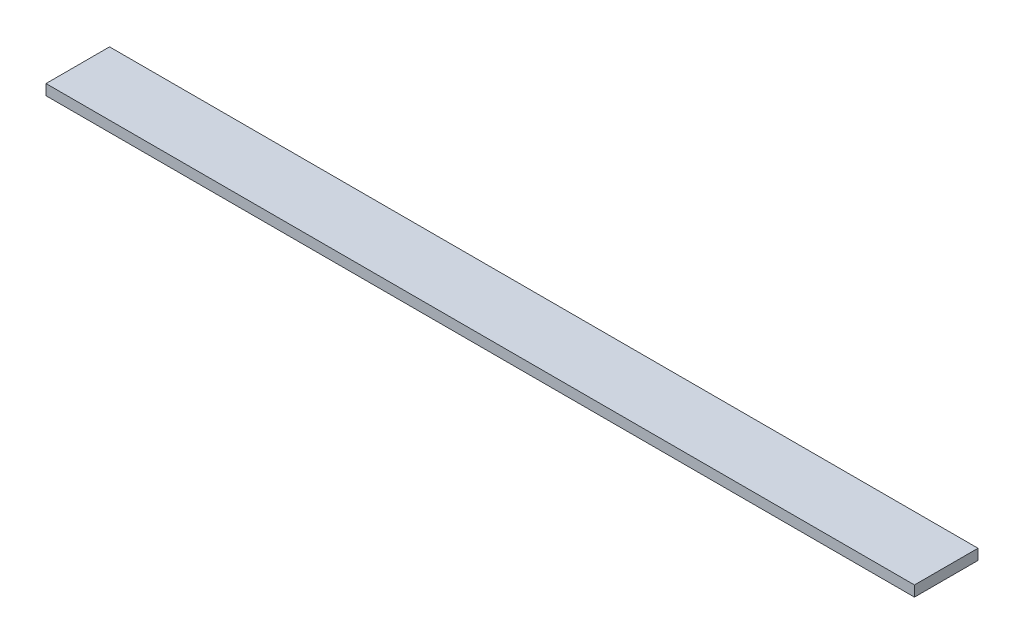
ISO-10303-21;
HEADER;
FILE_DESCRIPTION(('STEP AP214'),'2;1');
FILE_NAME('part.step','',(''),(''),'','','');
FILE_SCHEMA(('AUTOMOTIVE_DESIGN { 1 0 10303 214 1 1 1 1 }'));
ENDSEC;
DATA;
#1=APPLICATION_CONTEXT('core data for automotive mechanical design processes');
#2=APPLICATION_PROTOCOL_DEFINITION('international standard','automotive_design',2000,#1);
#3=PRODUCT_CONTEXT('',#1,'mechanical');
#4=PRODUCT('Part','Part','',(#3));
#5=PRODUCT_RELATED_PRODUCT_CATEGORY('part','',(#4));
#6=PRODUCT_DEFINITION_FORMATION('','',#4);
#7=PRODUCT_DEFINITION_CONTEXT('part definition',#1,'design');
#8=PRODUCT_DEFINITION('design','',#6,#7);
#9=PRODUCT_DEFINITION_SHAPE('','',#8);
#10=(LENGTH_UNIT() NAMED_UNIT(*) SI_UNIT(.MILLI.,.METRE.));
#11=(NAMED_UNIT(*) PLANE_ANGLE_UNIT() SI_UNIT($,.RADIAN.));
#12=(NAMED_UNIT(*) SI_UNIT($,.STERADIAN.) SOLID_ANGLE_UNIT());
#13=UNCERTAINTY_MEASURE_WITH_UNIT(LENGTH_MEASURE(1.E-05),#10,'distance_accuracy_value','');
#14=(GEOMETRIC_REPRESENTATION_CONTEXT(3) GLOBAL_UNCERTAINTY_ASSIGNED_CONTEXT((#13)) GLOBAL_UNIT_ASSIGNED_CONTEXT((#10,
#11,#12)) REPRESENTATION_CONTEXT('',''));
#15=CARTESIAN_POINT('',(0.,0.,0.));
#16=DIRECTION('',(0.,0.,1.));
#17=DIRECTION('',(1.,0.,0.));
#18=AXIS2_PLACEMENT_3D('',#15,#16,#17);
#19=CARTESIAN_POINT('',(0.,3.175,0.));
#20=DIRECTION('',(1.,0.,0.));
#21=DIRECTION('',(0.,0.,-1.));
#22=AXIS2_PLACEMENT_3D('',#19,#20,#21);
#23=PLANE('',#22);
#24=DIRECTION('',(0.,0.,1.));
#25=VECTOR('',#24,1.);
#26=CARTESIAN_POINT('',(0.,0.,0.));
#27=LINE('',#26,#25);
#28=CARTESIAN_POINT('',(0.,0.,-19.05));
#29=VERTEX_POINT('',#28);
#30=CARTESIAN_POINT('',(0.,0.,0.));
#31=VERTEX_POINT('',#30);
#32=EDGE_CURVE('E105',#29,#31,#27,.T.);
#33=ORIENTED_EDGE('',*,*,#32,.T.);
#34=DIRECTION('',(0.,-1.,0.));
#35=VECTOR('',#34,1.);
#36=CARTESIAN_POINT('',(0.,3.175,0.));
#37=LINE('',#36,#35);
#38=CARTESIAN_POINT('',(0.,3.175,0.));
#39=VERTEX_POINT('',#38);
#40=EDGE_CURVE('E11',#39,#31,#37,.T.);
#41=ORIENTED_EDGE('',*,*,#40,.F.);
#42=DIRECTION('',(0.,0.,1.));
#43=VECTOR('',#42,1.);
#44=CARTESIAN_POINT('',(0.,3.175,0.));
#45=LINE('',#44,#43);
#46=CARTESIAN_POINT('',(0.,3.175,-19.05));
#47=VERTEX_POINT('',#46);
#48=EDGE_CURVE('E89',#47,#39,#45,.T.);
#49=ORIENTED_EDGE('',*,*,#48,.F.);
#50=DIRECTION('',(0.,-1.,0.));
#51=VECTOR('',#50,1.);
#52=CARTESIAN_POINT('',(0.,3.175,-19.05));
#53=LINE('',#52,#51);
#54=EDGE_CURVE('E97',#47,#29,#53,.T.);
#55=ORIENTED_EDGE('',*,*,#54,.T.);
#56=EDGE_LOOP('',(#33,#41,#49,#55));
#57=FACE_BOUND('',#56,.T.);
#58=ADVANCED_FACE('F39',(#57),#23,.F.);
#59=CARTESIAN_POINT('',(0.,3.175,0.));
#60=DIRECTION('',(0.,0.,-1.));
#61=DIRECTION('',(-1.,0.,0.));
#62=AXIS2_PLACEMENT_3D('',#59,#60,#61);
#63=PLANE('',#62);
#64=DIRECTION('',(1.,0.,0.));
#65=VECTOR('',#64,1.);
#66=CARTESIAN_POINT('',(0.,0.,0.));
#67=LINE('',#66,#65);
#68=CARTESIAN_POINT('',(260.35,0.,0.));
#69=VERTEX_POINT('',#68);
#70=EDGE_CURVE('E92',#31,#69,#67,.T.);
#71=ORIENTED_EDGE('',*,*,#70,.T.);
#72=DIRECTION('',(0.,-1.,0.));
#73=VECTOR('',#72,1.);
#74=CARTESIAN_POINT('',(260.35,3.175,0.));
#75=LINE('',#74,#73);
#76=CARTESIAN_POINT('',(260.35,3.175,0.));
#77=VERTEX_POINT('',#76);
#78=EDGE_CURVE('E50',#77,#69,#75,.T.);
#79=ORIENTED_EDGE('',*,*,#78,.F.);
#80=DIRECTION('',(1.,0.,0.));
#81=VECTOR('',#80,1.);
#82=CARTESIAN_POINT('',(0.,3.175,0.));
#83=LINE('',#82,#81);
#84=EDGE_CURVE('E82',#39,#77,#83,.T.);
#85=ORIENTED_EDGE('',*,*,#84,.F.);
#86=ORIENTED_EDGE('',*,*,#40,.T.);
#87=EDGE_LOOP('',(#71,#79,#85,#86));
#88=FACE_BOUND('',#87,.T.);
#89=ADVANCED_FACE('F93',(#88),#63,.F.);
#90=CARTESIAN_POINT('',(260.35,3.175,0.));
#91=DIRECTION('',(-1.,0.,0.));
#92=DIRECTION('',(0.,0.,1.));
#93=AXIS2_PLACEMENT_3D('',#90,#91,#92);
#94=PLANE('',#93);
#95=DIRECTION('',(0.,0.,-1.));
#96=VECTOR('',#95,1.);
#97=CARTESIAN_POINT('',(260.35,0.,0.));
#98=LINE('',#97,#96);
#99=CARTESIAN_POINT('',(260.35,0.,-19.05));
#100=VERTEX_POINT('',#99);
#101=EDGE_CURVE('E75',#69,#100,#98,.T.);
#102=ORIENTED_EDGE('',*,*,#101,.T.);
#103=DIRECTION('',(0.,-1.,0.));
#104=VECTOR('',#103,1.);
#105=CARTESIAN_POINT('',(260.35,3.175,-19.05));
#106=LINE('',#105,#104);
#107=CARTESIAN_POINT('',(260.35,3.175,-19.05));
#108=VERTEX_POINT('',#107);
#109=EDGE_CURVE('E94',#108,#100,#106,.T.);
#110=ORIENTED_EDGE('',*,*,#109,.F.);
#111=DIRECTION('',(0.,0.,-1.));
#112=VECTOR('',#111,1.);
#113=CARTESIAN_POINT('',(260.35,3.175,0.));
#114=LINE('',#113,#112);
#115=EDGE_CURVE('E88',#77,#108,#114,.T.);
#116=ORIENTED_EDGE('',*,*,#115,.F.);
#117=ORIENTED_EDGE('',*,*,#78,.T.);
#118=EDGE_LOOP('',(#102,#110,#116,#117));
#119=FACE_BOUND('',#118,.T.);
#120=ADVANCED_FACE('F96',(#119),#94,.F.);
#121=CARTESIAN_POINT('',(0.,3.175,-19.05));
#122=DIRECTION('',(0.,0.,1.));
#123=DIRECTION('',(1.,0.,0.));
#124=AXIS2_PLACEMENT_3D('',#121,#122,#123);
#125=PLANE('',#124);
#126=DIRECTION('',(-1.,0.,0.));
#127=VECTOR('',#126,1.);
#128=CARTESIAN_POINT('',(0.,0.,-19.05));
#129=LINE('',#128,#127);
#130=EDGE_CURVE('E76',#100,#29,#129,.T.);
#131=ORIENTED_EDGE('',*,*,#130,.T.);
#132=ORIENTED_EDGE('',*,*,#54,.F.);
#133=DIRECTION('',(-1.,0.,0.));
#134=VECTOR('',#133,1.);
#135=CARTESIAN_POINT('',(0.,3.175,-19.05));
#136=LINE('',#135,#134);
#137=EDGE_CURVE('E54',#108,#47,#136,.T.);
#138=ORIENTED_EDGE('',*,*,#137,.F.);
#139=ORIENTED_EDGE('',*,*,#109,.T.);
#140=EDGE_LOOP('',(#131,#132,#138,#139));
#141=FACE_BOUND('',#140,.T.);
#142=ADVANCED_FACE('F109',(#141),#125,.F.);
#143=CARTESIAN_POINT('',(0.,3.175,0.));
#144=DIRECTION('',(0.,-1.,0.));
#145=DIRECTION('',(0.,0.,-1.));
#146=AXIS2_PLACEMENT_3D('',#143,#144,#145);
#147=PLANE('',#146);
#148=ORIENTED_EDGE('',*,*,#48,.T.);
#149=ORIENTED_EDGE('',*,*,#84,.T.);
#150=ORIENTED_EDGE('',*,*,#115,.T.);
#151=ORIENTED_EDGE('',*,*,#137,.T.);
#152=EDGE_LOOP('',(#148,#149,#150,#151));
#153=FACE_BOUND('',#152,.T.);
#154=ADVANCED_FACE('F86',(#153),#147,.F.);
#155=CARTESIAN_POINT('',(0.,0.,0.));
#156=DIRECTION('',(0.,-1.,0.));
#157=DIRECTION('',(0.,0.,-1.));
#158=AXIS2_PLACEMENT_3D('',#155,#156,#157);
#159=PLANE('',#158);
#160=ORIENTED_EDGE('',*,*,#32,.F.);
#161=ORIENTED_EDGE('',*,*,#130,.F.);
#162=ORIENTED_EDGE('',*,*,#101,.F.);
#163=ORIENTED_EDGE('',*,*,#70,.F.);
#164=EDGE_LOOP('',(#160,#161,#162,#163));
#165=FACE_BOUND('',#164,.T.);
#166=ADVANCED_FACE('F115',(#165),#159,.T.);
#167=CLOSED_SHELL('',(#58,#89,#120,#142,#154,#166));
#168=MANIFOLD_SOLID_BREP('B2',#167);
#169=ADVANCED_BREP_SHAPE_REPRESENTATION('',(#18,#168),#14);
#170=SHAPE_DEFINITION_REPRESENTATION(#9,#169);
ENDSEC;
END-ISO-10303-21;
